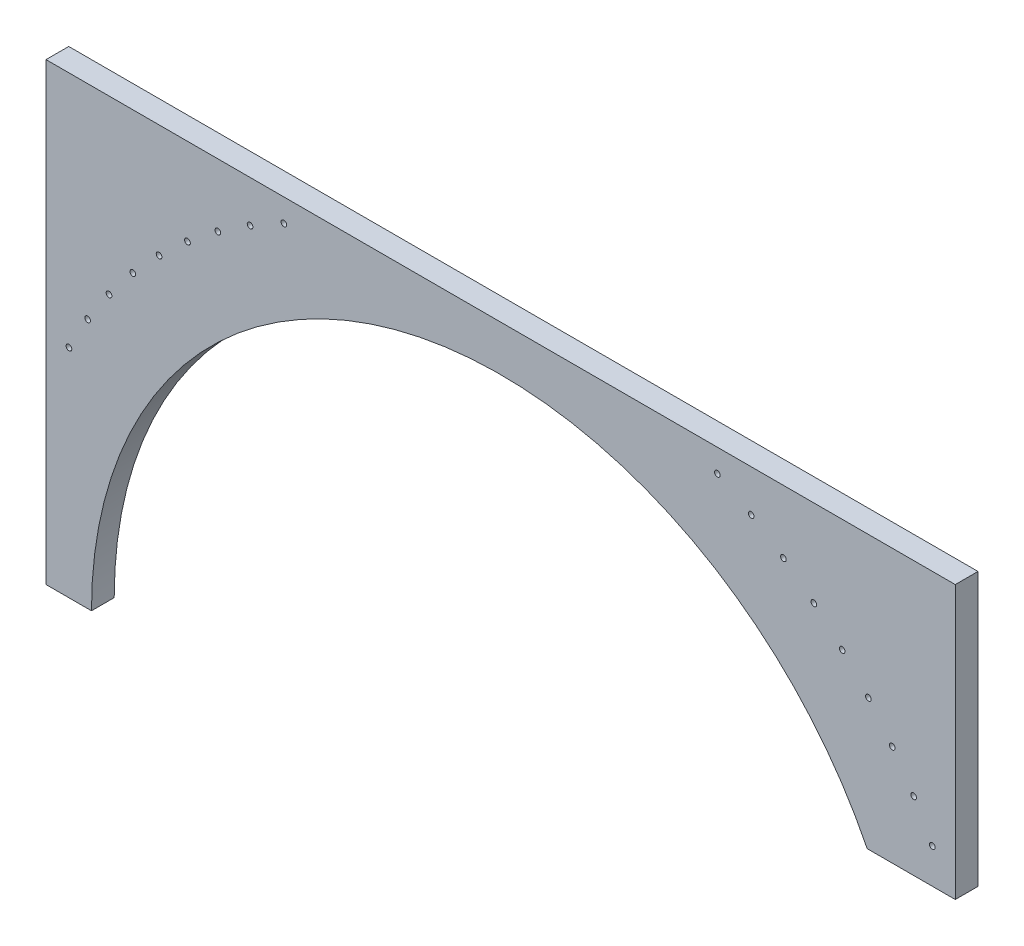
ISO-10303-21;
HEADER;
FILE_DESCRIPTION(('STEP AP214'),'2;1');
FILE_NAME('part.step','',(''),(''),'','','');
FILE_SCHEMA(('AUTOMOTIVE_DESIGN { 1 0 10303 214 1 1 1 1 }'));
ENDSEC;
DATA;
#1=APPLICATION_CONTEXT('core data for automotive mechanical design processes');
#2=APPLICATION_PROTOCOL_DEFINITION('international standard','automotive_design',2000,#1);
#3=PRODUCT_CONTEXT('',#1,'mechanical');
#4=PRODUCT('Part','Part','',(#3));
#5=PRODUCT_RELATED_PRODUCT_CATEGORY('part','',(#4));
#6=PRODUCT_DEFINITION_FORMATION('','',#4);
#7=PRODUCT_DEFINITION_CONTEXT('part definition',#1,'design');
#8=PRODUCT_DEFINITION('design','',#6,#7);
#9=PRODUCT_DEFINITION_SHAPE('','',#8);
#10=(LENGTH_UNIT() NAMED_UNIT(*) SI_UNIT(.MILLI.,.METRE.));
#11=(NAMED_UNIT(*) PLANE_ANGLE_UNIT() SI_UNIT($,.RADIAN.));
#12=(NAMED_UNIT(*) SI_UNIT($,.STERADIAN.) SOLID_ANGLE_UNIT());
#13=UNCERTAINTY_MEASURE_WITH_UNIT(LENGTH_MEASURE(1.E-05),#10,'distance_accuracy_value','');
#14=(GEOMETRIC_REPRESENTATION_CONTEXT(3) GLOBAL_UNCERTAINTY_ASSIGNED_CONTEXT((#13)) GLOBAL_UNIT_ASSIGNED_CONTEXT((#10,
#11,#12)) REPRESENTATION_CONTEXT('',''));
#15=CARTESIAN_POINT('',(0.,0.,0.));
#16=DIRECTION('',(0.,0.,1.));
#17=DIRECTION('',(1.,0.,0.));
#18=AXIS2_PLACEMENT_3D('',#15,#16,#17);
#19=CARTESIAN_POINT('',(40.,16.,2.));
#20=DIRECTION('',(0.,1.,0.));
#21=DIRECTION('',(0.,0.,1.));
#22=AXIS2_PLACEMENT_3D('',#19,#20,#21);
#23=PLANE('',#22);
#24=DIRECTION('',(1.,0.,0.));
#25=VECTOR('',#24,1.);
#26=CARTESIAN_POINT('',(40.,16.,0.));
#27=LINE('',#26,#25);
#28=CARTESIAN_POINT('',(32.2490309931942,16.,0.));
#29=VERTEX_POINT('',#28);
#30=CARTESIAN_POINT('',(40.,16.,0.));
#31=VERTEX_POINT('',#30);
#32=EDGE_CURVE('E117',#29,#31,#27,.T.);
#33=ORIENTED_EDGE('',*,*,#32,.T.);
#34=DIRECTION('',(0.,0.,-1.));
#35=VECTOR('',#34,1.);
#36=CARTESIAN_POINT('',(40.,16.,2.));
#37=LINE('',#36,#35);
#38=CARTESIAN_POINT('',(40.,16.,2.));
#39=VERTEX_POINT('',#38);
#40=EDGE_CURVE('E11',#39,#31,#37,.T.);
#41=ORIENTED_EDGE('',*,*,#40,.F.);
#42=DIRECTION('',(1.,0.,0.));
#43=VECTOR('',#42,1.);
#44=CARTESIAN_POINT('',(40.,16.,2.));
#45=LINE('',#44,#43);
#46=CARTESIAN_POINT('',(32.2490309931942,16.,2.));
#47=VERTEX_POINT('',#46);
#48=EDGE_CURVE('E128',#47,#39,#45,.T.);
#49=ORIENTED_EDGE('',*,*,#48,.F.);
#50=DIRECTION('',(0.,0.,-1.));
#51=VECTOR('',#50,1.);
#52=CARTESIAN_POINT('',(32.2490309931942,16.,2.));
#53=LINE('',#52,#51);
#54=EDGE_CURVE('E113',#47,#29,#53,.T.);
#55=ORIENTED_EDGE('',*,*,#54,.T.);
#56=EDGE_LOOP('',(#33,#41,#49,#55));
#57=FACE_BOUND('',#56,.T.);
#58=ADVANCED_FACE('F33',(#57),#23,.F.);
#59=CARTESIAN_POINT('',(40.,16.,2.));
#60=DIRECTION('',(-1.,0.,0.));
#61=DIRECTION('',(0.,-1.,0.));
#62=AXIS2_PLACEMENT_3D('',#59,#60,#61);
#63=PLANE('',#62);
#64=DIRECTION('',(0.,1.,0.));
#65=VECTOR('',#64,1.);
#66=CARTESIAN_POINT('',(40.,16.,0.));
#67=LINE('',#66,#65);
#68=CARTESIAN_POINT('',(40.,40.,0.));
#69=VERTEX_POINT('',#68);
#70=EDGE_CURVE('E120',#31,#69,#67,.T.);
#71=ORIENTED_EDGE('',*,*,#70,.T.);
#72=DIRECTION('',(0.,0.,-1.));
#73=VECTOR('',#72,1.);
#74=CARTESIAN_POINT('',(40.,40.,2.));
#75=LINE('',#74,#73);
#76=CARTESIAN_POINT('',(40.,40.,2.));
#77=VERTEX_POINT('',#76);
#78=EDGE_CURVE('E41',#77,#69,#75,.T.);
#79=ORIENTED_EDGE('',*,*,#78,.F.);
#80=DIRECTION('',(0.,1.,0.));
#81=VECTOR('',#80,1.);
#82=CARTESIAN_POINT('',(40.,16.,2.));
#83=LINE('',#82,#81);
#84=EDGE_CURVE('E86',#39,#77,#83,.T.);
#85=ORIENTED_EDGE('',*,*,#84,.F.);
#86=ORIENTED_EDGE('',*,*,#40,.T.);
#87=EDGE_LOOP('',(#71,#79,#85,#86));
#88=FACE_BOUND('',#87,.T.);
#89=ADVANCED_FACE('F153',(#88),#63,.F.);
#90=CARTESIAN_POINT('',(40.,40.,2.));
#91=DIRECTION('',(0.,-1.,0.));
#92=DIRECTION('',(1.,0.,0.));
#93=AXIS2_PLACEMENT_3D('',#90,#91,#92);
#94=PLANE('',#93);
#95=DIRECTION('',(-1.,0.,0.));
#96=VECTOR('',#95,1.);
#97=CARTESIAN_POINT('',(40.,40.,0.));
#98=LINE('',#97,#96);
#99=CARTESIAN_POINT('',(-40.,40.,0.));
#100=VERTEX_POINT('',#99);
#101=EDGE_CURVE('E123',#69,#100,#98,.T.);
#102=ORIENTED_EDGE('',*,*,#101,.T.);
#103=DIRECTION('',(0.,0.,-1.));
#104=VECTOR('',#103,1.);
#105=CARTESIAN_POINT('',(-40.,40.,2.));
#106=LINE('',#105,#104);
#107=CARTESIAN_POINT('',(-40.,40.,2.));
#108=VERTEX_POINT('',#107);
#109=EDGE_CURVE('E108',#108,#100,#106,.T.);
#110=ORIENTED_EDGE('',*,*,#109,.F.);
#111=DIRECTION('',(-1.,0.,0.));
#112=VECTOR('',#111,1.);
#113=CARTESIAN_POINT('',(40.,40.,2.));
#114=LINE('',#113,#112);
#115=EDGE_CURVE('E99',#77,#108,#114,.T.);
#116=ORIENTED_EDGE('',*,*,#115,.F.);
#117=ORIENTED_EDGE('',*,*,#78,.T.);
#118=EDGE_LOOP('',(#102,#110,#116,#117));
#119=FACE_BOUND('',#118,.T.);
#120=ADVANCED_FACE('F134',(#119),#94,.F.);
#121=CARTESIAN_POINT('',(-40.,40.,2.));
#122=DIRECTION('',(1.,0.,0.));
#123=DIRECTION('',(0.,1.,0.));
#124=AXIS2_PLACEMENT_3D('',#121,#122,#123);
#125=PLANE('',#124);
#126=DIRECTION('',(0.,-1.,0.));
#127=VECTOR('',#126,1.);
#128=CARTESIAN_POINT('',(-40.,40.,0.));
#129=LINE('',#128,#127);
#130=CARTESIAN_POINT('',(-40.,0.,0.));
#131=VERTEX_POINT('',#130);
#132=EDGE_CURVE('E107',#100,#131,#129,.T.);
#133=ORIENTED_EDGE('',*,*,#132,.T.);
#134=DIRECTION('',(0.,0.,-1.));
#135=VECTOR('',#134,1.);
#136=CARTESIAN_POINT('',(-40.,0.,2.));
#137=LINE('',#136,#135);
#138=CARTESIAN_POINT('',(-40.,0.,2.));
#139=VERTEX_POINT('',#138);
#140=EDGE_CURVE('E104',#139,#131,#137,.T.);
#141=ORIENTED_EDGE('',*,*,#140,.F.);
#142=DIRECTION('',(0.,-1.,0.));
#143=VECTOR('',#142,1.);
#144=CARTESIAN_POINT('',(-40.,40.,2.));
#145=LINE('',#144,#143);
#146=EDGE_CURVE('E93',#108,#139,#145,.T.);
#147=ORIENTED_EDGE('',*,*,#146,.F.);
#148=ORIENTED_EDGE('',*,*,#109,.T.);
#149=EDGE_LOOP('',(#133,#141,#147,#148));
#150=FACE_BOUND('',#149,.T.);
#151=ADVANCED_FACE('F105',(#150),#125,.F.);
#152=CARTESIAN_POINT('',(-36.,0.,2.));
#153=DIRECTION('',(0.,1.,0.));
#154=DIRECTION('',(-1.,0.,0.));
#155=AXIS2_PLACEMENT_3D('',#152,#153,#154);
#156=PLANE('',#155);
#157=DIRECTION('',(1.,0.,0.));
#158=VECTOR('',#157,1.);
#159=CARTESIAN_POINT('',(-36.,0.,0.));
#160=LINE('',#159,#158);
#161=CARTESIAN_POINT('',(-36.,0.,0.));
#162=VERTEX_POINT('',#161);
#163=EDGE_CURVE('E72',#131,#162,#160,.T.);
#164=ORIENTED_EDGE('',*,*,#163,.T.);
#165=DIRECTION('',(0.,0.,-1.));
#166=VECTOR('',#165,1.);
#167=CARTESIAN_POINT('',(-36.,0.,2.));
#168=LINE('',#167,#166);
#169=CARTESIAN_POINT('',(-36.,0.,2.));
#170=VERTEX_POINT('',#169);
#171=EDGE_CURVE('E109',#170,#162,#168,.T.);
#172=ORIENTED_EDGE('',*,*,#171,.F.);
#173=DIRECTION('',(1.,0.,0.));
#174=VECTOR('',#173,1.);
#175=CARTESIAN_POINT('',(-36.,0.,2.));
#176=LINE('',#175,#174);
#177=EDGE_CURVE('E97',#139,#170,#176,.T.);
#178=ORIENTED_EDGE('',*,*,#177,.F.);
#179=ORIENTED_EDGE('',*,*,#140,.T.);
#180=EDGE_LOOP('',(#164,#172,#178,#179));
#181=FACE_BOUND('',#180,.T.);
#182=ADVANCED_FACE('F111',(#181),#156,.F.);
#183=CARTESIAN_POINT('',(0.,0.,2.));
#184=DIRECTION('',(0.,0.,-1.));
#185=DIRECTION('',(-1.,0.,0.));
#186=AXIS2_PLACEMENT_3D('',#183,#184,#185);
#187=CYLINDRICAL_SURFACE('',#186,36.);
#188=CARTESIAN_POINT('',(0.,0.,0.));
#189=DIRECTION('',(0.,0.,-1.));
#190=DIRECTION('',(1.,0.,0.));
#191=AXIS2_PLACEMENT_3D('',#188,#189,#190);
#192=CIRCLE('',#191,36.);
#193=EDGE_CURVE('E78',#162,#29,#192,.T.);
#194=ORIENTED_EDGE('',*,*,#193,.T.);
#195=ORIENTED_EDGE('',*,*,#54,.F.);
#196=CARTESIAN_POINT('',(0.,0.,2.));
#197=DIRECTION('',(0.,0.,-1.));
#198=DIRECTION('',(1.,0.,0.));
#199=AXIS2_PLACEMENT_3D('',#196,#197,#198);
#200=CIRCLE('',#199,36.);
#201=EDGE_CURVE('E49',#170,#47,#200,.T.);
#202=ORIENTED_EDGE('',*,*,#201,.F.);
#203=ORIENTED_EDGE('',*,*,#171,.T.);
#204=EDGE_LOOP('',(#194,#195,#202,#203));
#205=FACE_BOUND('',#204,.T.);
#206=ADVANCED_FACE('F141',(#205),#187,.F.);
#207=CARTESIAN_POINT('',(0.,0.,2.));
#208=DIRECTION('',(0.,0.,1.));
#209=DIRECTION('',(1.,0.,0.));
#210=AXIS2_PLACEMENT_3D('',#207,#208,#209);
#211=PLANE('',#210);
#212=CARTESIAN_POINT('',(37.9814539466944,19.0698493988598,2.));
#213=DIRECTION('',(0.,0.,1.));
#214=DIRECTION('',(-1.,0.,0.));
#215=AXIS2_PLACEMENT_3D('',#212,#213,#214);
#216=CIRCLE('',#215,0.25);
#217=CARTESIAN_POINT('',(37.7314539466944,19.0698493988598,2.));
#218=VERTEX_POINT('',#217);
#219=EDGE_CURVE('E379',#218,#218,#216,.T.);
#220=ORIENTED_EDGE('',*,*,#219,.F.);
#221=EDGE_LOOP('',(#220));
#222=FACE_BOUND('',#221,.T.);
#223=CARTESIAN_POINT('',(36.3355463010969,22.0449104103625,2.));
#224=DIRECTION('',(0.,0.,1.));
#225=DIRECTION('',(-1.,0.,0.));
#226=AXIS2_PLACEMENT_3D('',#223,#224,#225);
#227=CIRCLE('',#226,0.25);
#228=CARTESIAN_POINT('',(36.0855463010969,22.0449104103625,2.));
#229=VERTEX_POINT('',#228);
#230=EDGE_CURVE('E381',#229,#229,#227,.T.);
#231=ORIENTED_EDGE('',*,*,#230,.F.);
#232=EDGE_LOOP('',(#231));
#233=FACE_BOUND('',#232,.T.);
#234=CARTESIAN_POINT('',(34.4570911591722,24.8788839952389,2.));
#235=DIRECTION('',(0.,0.,1.));
#236=DIRECTION('',(-1.,0.,0.));
#237=AXIS2_PLACEMENT_3D('',#234,#235,#236);
#238=CIRCLE('',#237,0.249999999999993);
#239=CARTESIAN_POINT('',(34.2070911591723,24.8788839952389,2.));
#240=VERTEX_POINT('',#239);
#241=EDGE_CURVE('E387',#240,#240,#238,.T.);
#242=ORIENTED_EDGE('',*,*,#241,.F.);
#243=EDGE_LOOP('',(#242));
#244=FACE_BOUND('',#243,.T.);
#245=CARTESIAN_POINT('',(32.358110633829,27.5536327225457,2.));
#246=DIRECTION('',(0.,0.,1.));
#247=DIRECTION('',(-1.,0.,0.));
#248=AXIS2_PLACEMENT_3D('',#245,#246,#247);
#249=CIRCLE('',#248,0.250000000000006);
#250=CARTESIAN_POINT('',(32.1081106338289,27.5536327225457,2.));
#251=VERTEX_POINT('',#250);
#252=EDGE_CURVE('E393',#251,#251,#249,.T.);
#253=ORIENTED_EDGE('',*,*,#252,.F.);
#254=EDGE_LOOP('',(#253));
#255=FACE_BOUND('',#254,.T.);
#256=CARTESIAN_POINT('',(30.0520382004291,30.0520382004283,2.));
#257=DIRECTION('',(0.,0.,1.));
#258=DIRECTION('',(-1.,0.,0.));
#259=AXIS2_PLACEMENT_3D('',#256,#257,#258);
#260=CIRCLE('',#259,0.249999999999992);
#261=CARTESIAN_POINT('',(29.8020382004291,30.0520382004283,2.));
#262=VERTEX_POINT('',#261);
#263=EDGE_CURVE('E399',#262,#262,#260,.T.);
#264=ORIENTED_EDGE('',*,*,#263,.F.);
#265=EDGE_LOOP('',(#264));
#266=FACE_BOUND('',#265,.T.);
#267=CARTESIAN_POINT('',(27.5536327225466,32.358110633828,2.));
#268=DIRECTION('',(0.,0.,1.));
#269=DIRECTION('',(-1.,0.,0.));
#270=AXIS2_PLACEMENT_3D('',#267,#268,#269);
#271=CIRCLE('',#270,0.25);
#272=CARTESIAN_POINT('',(27.3036327225466,32.358110633828,2.));
#273=VERTEX_POINT('',#272);
#274=EDGE_CURVE('E405',#273,#273,#271,.T.);
#275=ORIENTED_EDGE('',*,*,#274,.F.);
#276=EDGE_LOOP('',(#275));
#277=FACE_BOUND('',#276,.T.);
#278=CARTESIAN_POINT('',(24.8788839952397,34.4570911591713,2.));
#279=DIRECTION('',(0.,0.,1.));
#280=DIRECTION('',(-1.,0.,0.));
#281=AXIS2_PLACEMENT_3D('',#278,#279,#280);
#282=CIRCLE('',#281,0.250000000000003);
#283=CARTESIAN_POINT('',(24.6288839952397,34.4570911591713,2.));
#284=VERTEX_POINT('',#283);
#285=EDGE_CURVE('E411',#284,#284,#282,.T.);
#286=ORIENTED_EDGE('',*,*,#285,.F.);
#287=EDGE_LOOP('',(#286));
#288=FACE_BOUND('',#287,.T.);
#289=CARTESIAN_POINT('',(22.0449104103634,36.335546301096,2.));
#290=DIRECTION('',(0.,0.,1.));
#291=DIRECTION('',(-1.,0.,0.));
#292=AXIS2_PLACEMENT_3D('',#289,#290,#291);
#293=CIRCLE('',#292,0.25);
#294=CARTESIAN_POINT('',(21.7949104103634,36.335546301096,2.));
#295=VERTEX_POINT('',#294);
#296=EDGE_CURVE('E417',#295,#295,#293,.T.);
#297=ORIENTED_EDGE('',*,*,#296,.F.);
#298=EDGE_LOOP('',(#297));
#299=FACE_BOUND('',#298,.T.);
#300=CARTESIAN_POINT('',(19.0698493988607,37.9814539466935,2.));
#301=DIRECTION('',(0.,0.,1.));
#302=DIRECTION('',(-1.,0.,0.));
#303=AXIS2_PLACEMENT_3D('',#300,#301,#302);
#304=CIRCLE('',#303,0.250000000000006);
#305=CARTESIAN_POINT('',(18.8198493988607,37.9814539466935,2.));
#306=VERTEX_POINT('',#305);
#307=EDGE_CURVE('E423',#306,#306,#304,.T.);
#308=ORIENTED_EDGE('',*,*,#307,.F.);
#309=EDGE_LOOP('',(#308));
#310=FACE_BOUND('',#309,.T.);
#311=CARTESIAN_POINT('',(-19.0698493988607,37.9814539466935,2.));
#312=DIRECTION('',(0.,0.,1.));
#313=DIRECTION('',(1.,0.,0.));
#314=AXIS2_PLACEMENT_3D('',#311,#312,#313);
#315=CIRCLE('',#314,0.250000000000006);
#316=CARTESIAN_POINT('',(-18.8198493988607,37.9814539466935,2.));
#317=VERTEX_POINT('',#316);
#318=EDGE_CURVE('E429',#317,#317,#315,.T.);
#319=ORIENTED_EDGE('',*,*,#318,.F.);
#320=EDGE_LOOP('',(#319));
#321=FACE_BOUND('',#320,.T.);
#322=CARTESIAN_POINT('',(-22.0449104103634,36.335546301096,2.));
#323=DIRECTION('',(0.,0.,1.));
#324=DIRECTION('',(1.,0.,0.));
#325=AXIS2_PLACEMENT_3D('',#322,#323,#324);
#326=CIRCLE('',#325,0.25);
#327=CARTESIAN_POINT('',(-21.7949104103634,36.335546301096,2.));
#328=VERTEX_POINT('',#327);
#329=EDGE_CURVE('E435',#328,#328,#326,.T.);
#330=ORIENTED_EDGE('',*,*,#329,.F.);
#331=EDGE_LOOP('',(#330));
#332=FACE_BOUND('',#331,.T.);
#333=CARTESIAN_POINT('',(-24.8788839952397,34.4570911591713,2.));
#334=DIRECTION('',(0.,0.,1.));
#335=DIRECTION('',(1.,0.,0.));
#336=AXIS2_PLACEMENT_3D('',#333,#334,#335);
#337=CIRCLE('',#336,0.250000000000003);
#338=CARTESIAN_POINT('',(-24.6288839952397,34.4570911591713,2.));
#339=VERTEX_POINT('',#338);
#340=EDGE_CURVE('E441',#339,#339,#337,.T.);
#341=ORIENTED_EDGE('',*,*,#340,.F.);
#342=EDGE_LOOP('',(#341));
#343=FACE_BOUND('',#342,.T.);
#344=CARTESIAN_POINT('',(-27.5536327225466,32.358110633828,2.));
#345=DIRECTION('',(0.,0.,1.));
#346=DIRECTION('',(1.,0.,0.));
#347=AXIS2_PLACEMENT_3D('',#344,#345,#346);
#348=CIRCLE('',#347,0.25);
#349=CARTESIAN_POINT('',(-27.3036327225466,32.358110633828,2.));
#350=VERTEX_POINT('',#349);
#351=EDGE_CURVE('E447',#350,#350,#348,.T.);
#352=ORIENTED_EDGE('',*,*,#351,.F.);
#353=EDGE_LOOP('',(#352));
#354=FACE_BOUND('',#353,.T.);
#355=CARTESIAN_POINT('',(-30.0520382004291,30.0520382004283,2.));
#356=DIRECTION('',(0.,0.,1.));
#357=DIRECTION('',(1.,0.,0.));
#358=AXIS2_PLACEMENT_3D('',#355,#356,#357);
#359=CIRCLE('',#358,0.249999999999992);
#360=CARTESIAN_POINT('',(-29.8020382004291,30.0520382004283,2.));
#361=VERTEX_POINT('',#360);
#362=EDGE_CURVE('E453',#361,#361,#359,.T.);
#363=ORIENTED_EDGE('',*,*,#362,.F.);
#364=EDGE_LOOP('',(#363));
#365=FACE_BOUND('',#364,.T.);
#366=CARTESIAN_POINT('',(-32.358110633829,27.5536327225457,2.));
#367=DIRECTION('',(0.,0.,1.));
#368=DIRECTION('',(1.,0.,0.));
#369=AXIS2_PLACEMENT_3D('',#366,#367,#368);
#370=CIRCLE('',#369,0.250000000000006);
#371=CARTESIAN_POINT('',(-32.1081106338289,27.5536327225457,2.));
#372=VERTEX_POINT('',#371);
#373=EDGE_CURVE('E459',#372,#372,#370,.T.);
#374=ORIENTED_EDGE('',*,*,#373,.F.);
#375=EDGE_LOOP('',(#374));
#376=FACE_BOUND('',#375,.T.);
#377=CARTESIAN_POINT('',(-34.4570911591722,24.8788839952389,2.));
#378=DIRECTION('',(0.,0.,1.));
#379=DIRECTION('',(1.,0.,0.));
#380=AXIS2_PLACEMENT_3D('',#377,#378,#379);
#381=CIRCLE('',#380,0.249999999999993);
#382=CARTESIAN_POINT('',(-34.2070911591723,24.8788839952389,2.));
#383=VERTEX_POINT('',#382);
#384=EDGE_CURVE('E465',#383,#383,#381,.T.);
#385=ORIENTED_EDGE('',*,*,#384,.F.);
#386=EDGE_LOOP('',(#385));
#387=FACE_BOUND('',#386,.T.);
#388=CARTESIAN_POINT('',(-36.3355463010969,22.0449104103625,2.));
#389=DIRECTION('',(0.,0.,1.));
#390=DIRECTION('',(1.,0.,0.));
#391=AXIS2_PLACEMENT_3D('',#388,#389,#390);
#392=CIRCLE('',#391,0.25);
#393=CARTESIAN_POINT('',(-36.0855463010969,22.0449104103625,2.));
#394=VERTEX_POINT('',#393);
#395=EDGE_CURVE('E471',#394,#394,#392,.T.);
#396=ORIENTED_EDGE('',*,*,#395,.F.);
#397=EDGE_LOOP('',(#396));
#398=FACE_BOUND('',#397,.T.);
#399=CARTESIAN_POINT('',(-37.9814539466944,19.0698493988598,2.));
#400=DIRECTION('',(0.,0.,1.));
#401=DIRECTION('',(1.,0.,0.));
#402=AXIS2_PLACEMENT_3D('',#399,#400,#401);
#403=CIRCLE('',#402,0.25);
#404=CARTESIAN_POINT('',(-37.7314539466944,19.0698493988598,2.));
#405=VERTEX_POINT('',#404);
#406=EDGE_CURVE('E477',#405,#405,#403,.T.);
#407=ORIENTED_EDGE('',*,*,#406,.F.);
#408=EDGE_LOOP('',(#407));
#409=FACE_BOUND('',#408,.T.);
#410=ORIENTED_EDGE('',*,*,#48,.T.);
#411=ORIENTED_EDGE('',*,*,#84,.T.);
#412=ORIENTED_EDGE('',*,*,#115,.T.);
#413=ORIENTED_EDGE('',*,*,#146,.T.);
#414=ORIENTED_EDGE('',*,*,#177,.T.);
#415=ORIENTED_EDGE('',*,*,#201,.T.);
#416=EDGE_LOOP('',(#410,#411,#412,#413,#414,#415));
#417=FACE_BOUND('',#416,.T.);
#418=ADVANCED_FACE('F95',(#222,#233,#244,#255,#266,#277,#288,#299,#310,#321,#332,#343,#354,#365,
#376,#387,#398,#409,#417),#211,.T.);
#419=CARTESIAN_POINT('',(0.,0.,0.));
#420=DIRECTION('',(0.,0.,1.));
#421=DIRECTION('',(1.,0.,0.));
#422=AXIS2_PLACEMENT_3D('',#419,#420,#421);
#423=PLANE('',#422);
#424=CARTESIAN_POINT('',(37.9814539466944,19.0698493988598,0.));
#425=DIRECTION('',(0.,0.,1.));
#426=DIRECTION('',(-1.,0.,0.));
#427=AXIS2_PLACEMENT_3D('',#424,#425,#426);
#428=CIRCLE('',#427,0.25);
#429=CARTESIAN_POINT('',(37.7314539466944,19.0698493988598,0.));
#430=VERTEX_POINT('',#429);
#431=EDGE_CURVE('E376',#430,#430,#428,.T.);
#432=ORIENTED_EDGE('',*,*,#431,.T.);
#433=EDGE_LOOP('',(#432));
#434=FACE_BOUND('',#433,.T.);
#435=CARTESIAN_POINT('',(36.3355463010969,22.0449104103625,0.));
#436=DIRECTION('',(0.,0.,1.));
#437=DIRECTION('',(-1.,0.,0.));
#438=AXIS2_PLACEMENT_3D('',#435,#436,#437);
#439=CIRCLE('',#438,0.25);
#440=CARTESIAN_POINT('',(36.0855463010969,22.0449104103625,0.));
#441=VERTEX_POINT('',#440);
#442=EDGE_CURVE('E384',#441,#441,#439,.T.);
#443=ORIENTED_EDGE('',*,*,#442,.T.);
#444=EDGE_LOOP('',(#443));
#445=FACE_BOUND('',#444,.T.);
#446=CARTESIAN_POINT('',(34.4570911591722,24.8788839952389,0.));
#447=DIRECTION('',(0.,0.,1.));
#448=DIRECTION('',(-1.,0.,0.));
#449=AXIS2_PLACEMENT_3D('',#446,#447,#448);
#450=CIRCLE('',#449,0.249999999999993);
#451=CARTESIAN_POINT('',(34.2070911591723,24.8788839952389,0.));
#452=VERTEX_POINT('',#451);
#453=EDGE_CURVE('E390',#452,#452,#450,.T.);
#454=ORIENTED_EDGE('',*,*,#453,.T.);
#455=EDGE_LOOP('',(#454));
#456=FACE_BOUND('',#455,.T.);
#457=CARTESIAN_POINT('',(32.358110633829,27.5536327225457,0.));
#458=DIRECTION('',(0.,0.,1.));
#459=DIRECTION('',(-1.,0.,0.));
#460=AXIS2_PLACEMENT_3D('',#457,#458,#459);
#461=CIRCLE('',#460,0.250000000000006);
#462=CARTESIAN_POINT('',(32.1081106338289,27.5536327225457,0.));
#463=VERTEX_POINT('',#462);
#464=EDGE_CURVE('E396',#463,#463,#461,.T.);
#465=ORIENTED_EDGE('',*,*,#464,.T.);
#466=EDGE_LOOP('',(#465));
#467=FACE_BOUND('',#466,.T.);
#468=CARTESIAN_POINT('',(30.0520382004291,30.0520382004283,0.));
#469=DIRECTION('',(0.,0.,1.));
#470=DIRECTION('',(-1.,0.,0.));
#471=AXIS2_PLACEMENT_3D('',#468,#469,#470);
#472=CIRCLE('',#471,0.249999999999992);
#473=CARTESIAN_POINT('',(29.8020382004291,30.0520382004283,0.));
#474=VERTEX_POINT('',#473);
#475=EDGE_CURVE('E402',#474,#474,#472,.T.);
#476=ORIENTED_EDGE('',*,*,#475,.T.);
#477=EDGE_LOOP('',(#476));
#478=FACE_BOUND('',#477,.T.);
#479=CARTESIAN_POINT('',(27.5536327225466,32.358110633828,0.));
#480=DIRECTION('',(0.,0.,1.));
#481=DIRECTION('',(-1.,0.,0.));
#482=AXIS2_PLACEMENT_3D('',#479,#480,#481);
#483=CIRCLE('',#482,0.25);
#484=CARTESIAN_POINT('',(27.3036327225466,32.358110633828,0.));
#485=VERTEX_POINT('',#484);
#486=EDGE_CURVE('E408',#485,#485,#483,.T.);
#487=ORIENTED_EDGE('',*,*,#486,.T.);
#488=EDGE_LOOP('',(#487));
#489=FACE_BOUND('',#488,.T.);
#490=CARTESIAN_POINT('',(24.8788839952397,34.4570911591713,0.));
#491=DIRECTION('',(0.,0.,1.));
#492=DIRECTION('',(-1.,0.,0.));
#493=AXIS2_PLACEMENT_3D('',#490,#491,#492);
#494=CIRCLE('',#493,0.250000000000003);
#495=CARTESIAN_POINT('',(24.6288839952397,34.4570911591713,0.));
#496=VERTEX_POINT('',#495);
#497=EDGE_CURVE('E414',#496,#496,#494,.T.);
#498=ORIENTED_EDGE('',*,*,#497,.T.);
#499=EDGE_LOOP('',(#498));
#500=FACE_BOUND('',#499,.T.);
#501=CARTESIAN_POINT('',(22.0449104103634,36.335546301096,0.));
#502=DIRECTION('',(0.,0.,1.));
#503=DIRECTION('',(-1.,0.,0.));
#504=AXIS2_PLACEMENT_3D('',#501,#502,#503);
#505=CIRCLE('',#504,0.25);
#506=CARTESIAN_POINT('',(21.7949104103634,36.335546301096,0.));
#507=VERTEX_POINT('',#506);
#508=EDGE_CURVE('E420',#507,#507,#505,.T.);
#509=ORIENTED_EDGE('',*,*,#508,.T.);
#510=EDGE_LOOP('',(#509));
#511=FACE_BOUND('',#510,.T.);
#512=CARTESIAN_POINT('',(19.0698493988607,37.9814539466935,0.));
#513=DIRECTION('',(0.,0.,1.));
#514=DIRECTION('',(-1.,0.,0.));
#515=AXIS2_PLACEMENT_3D('',#512,#513,#514);
#516=CIRCLE('',#515,0.250000000000006);
#517=CARTESIAN_POINT('',(18.8198493988607,37.9814539466935,0.));
#518=VERTEX_POINT('',#517);
#519=EDGE_CURVE('E426',#518,#518,#516,.T.);
#520=ORIENTED_EDGE('',*,*,#519,.T.);
#521=EDGE_LOOP('',(#520));
#522=FACE_BOUND('',#521,.T.);
#523=CARTESIAN_POINT('',(-19.0698493988607,37.9814539466935,0.));
#524=DIRECTION('',(0.,0.,1.));
#525=DIRECTION('',(1.,0.,0.));
#526=AXIS2_PLACEMENT_3D('',#523,#524,#525);
#527=CIRCLE('',#526,0.250000000000006);
#528=CARTESIAN_POINT('',(-18.8198493988607,37.9814539466935,0.));
#529=VERTEX_POINT('',#528);
#530=EDGE_CURVE('E432',#529,#529,#527,.T.);
#531=ORIENTED_EDGE('',*,*,#530,.T.);
#532=EDGE_LOOP('',(#531));
#533=FACE_BOUND('',#532,.T.);
#534=CARTESIAN_POINT('',(-22.0449104103634,36.335546301096,0.));
#535=DIRECTION('',(0.,0.,1.));
#536=DIRECTION('',(1.,0.,0.));
#537=AXIS2_PLACEMENT_3D('',#534,#535,#536);
#538=CIRCLE('',#537,0.25);
#539=CARTESIAN_POINT('',(-21.7949104103634,36.335546301096,0.));
#540=VERTEX_POINT('',#539);
#541=EDGE_CURVE('E438',#540,#540,#538,.T.);
#542=ORIENTED_EDGE('',*,*,#541,.T.);
#543=EDGE_LOOP('',(#542));
#544=FACE_BOUND('',#543,.T.);
#545=CARTESIAN_POINT('',(-24.8788839952397,34.4570911591713,0.));
#546=DIRECTION('',(0.,0.,1.));
#547=DIRECTION('',(1.,0.,0.));
#548=AXIS2_PLACEMENT_3D('',#545,#546,#547);
#549=CIRCLE('',#548,0.250000000000003);
#550=CARTESIAN_POINT('',(-24.6288839952397,34.4570911591713,0.));
#551=VERTEX_POINT('',#550);
#552=EDGE_CURVE('E444',#551,#551,#549,.T.);
#553=ORIENTED_EDGE('',*,*,#552,.T.);
#554=EDGE_LOOP('',(#553));
#555=FACE_BOUND('',#554,.T.);
#556=CARTESIAN_POINT('',(-27.5536327225466,32.358110633828,0.));
#557=DIRECTION('',(0.,0.,1.));
#558=DIRECTION('',(1.,0.,0.));
#559=AXIS2_PLACEMENT_3D('',#556,#557,#558);
#560=CIRCLE('',#559,0.25);
#561=CARTESIAN_POINT('',(-27.3036327225466,32.358110633828,0.));
#562=VERTEX_POINT('',#561);
#563=EDGE_CURVE('E450',#562,#562,#560,.T.);
#564=ORIENTED_EDGE('',*,*,#563,.T.);
#565=EDGE_LOOP('',(#564));
#566=FACE_BOUND('',#565,.T.);
#567=CARTESIAN_POINT('',(-30.0520382004291,30.0520382004283,0.));
#568=DIRECTION('',(0.,0.,1.));
#569=DIRECTION('',(1.,0.,0.));
#570=AXIS2_PLACEMENT_3D('',#567,#568,#569);
#571=CIRCLE('',#570,0.249999999999992);
#572=CARTESIAN_POINT('',(-29.8020382004291,30.0520382004283,0.));
#573=VERTEX_POINT('',#572);
#574=EDGE_CURVE('E456',#573,#573,#571,.T.);
#575=ORIENTED_EDGE('',*,*,#574,.T.);
#576=EDGE_LOOP('',(#575));
#577=FACE_BOUND('',#576,.T.);
#578=CARTESIAN_POINT('',(-32.358110633829,27.5536327225457,0.));
#579=DIRECTION('',(0.,0.,1.));
#580=DIRECTION('',(1.,0.,0.));
#581=AXIS2_PLACEMENT_3D('',#578,#579,#580);
#582=CIRCLE('',#581,0.250000000000006);
#583=CARTESIAN_POINT('',(-32.1081106338289,27.5536327225457,0.));
#584=VERTEX_POINT('',#583);
#585=EDGE_CURVE('E462',#584,#584,#582,.T.);
#586=ORIENTED_EDGE('',*,*,#585,.T.);
#587=EDGE_LOOP('',(#586));
#588=FACE_BOUND('',#587,.T.);
#589=CARTESIAN_POINT('',(-34.4570911591722,24.8788839952389,0.));
#590=DIRECTION('',(0.,0.,1.));
#591=DIRECTION('',(1.,0.,0.));
#592=AXIS2_PLACEMENT_3D('',#589,#590,#591);
#593=CIRCLE('',#592,0.249999999999993);
#594=CARTESIAN_POINT('',(-34.2070911591723,24.8788839952389,0.));
#595=VERTEX_POINT('',#594);
#596=EDGE_CURVE('E468',#595,#595,#593,.T.);
#597=ORIENTED_EDGE('',*,*,#596,.T.);
#598=EDGE_LOOP('',(#597));
#599=FACE_BOUND('',#598,.T.);
#600=CARTESIAN_POINT('',(-36.3355463010969,22.0449104103625,0.));
#601=DIRECTION('',(0.,0.,1.));
#602=DIRECTION('',(1.,0.,0.));
#603=AXIS2_PLACEMENT_3D('',#600,#601,#602);
#604=CIRCLE('',#603,0.25);
#605=CARTESIAN_POINT('',(-36.0855463010969,22.0449104103625,0.));
#606=VERTEX_POINT('',#605);
#607=EDGE_CURVE('E474',#606,#606,#604,.T.);
#608=ORIENTED_EDGE('',*,*,#607,.T.);
#609=EDGE_LOOP('',(#608));
#610=FACE_BOUND('',#609,.T.);
#611=CARTESIAN_POINT('',(-37.9814539466944,19.0698493988598,0.));
#612=DIRECTION('',(0.,0.,1.));
#613=DIRECTION('',(1.,0.,0.));
#614=AXIS2_PLACEMENT_3D('',#611,#612,#613);
#615=CIRCLE('',#614,0.25);
#616=CARTESIAN_POINT('',(-37.7314539466944,19.0698493988598,0.));
#617=VERTEX_POINT('',#616);
#618=EDGE_CURVE('E121',#617,#617,#615,.T.);
#619=ORIENTED_EDGE('',*,*,#618,.T.);
#620=EDGE_LOOP('',(#619));
#621=FACE_BOUND('',#620,.T.);
#622=ORIENTED_EDGE('',*,*,#32,.F.);
#623=ORIENTED_EDGE('',*,*,#193,.F.);
#624=ORIENTED_EDGE('',*,*,#163,.F.);
#625=ORIENTED_EDGE('',*,*,#132,.F.);
#626=ORIENTED_EDGE('',*,*,#101,.F.);
#627=ORIENTED_EDGE('',*,*,#70,.F.);
#628=EDGE_LOOP('',(#622,#623,#624,#625,#626,#627));
#629=FACE_BOUND('',#628,.T.);
#630=ADVANCED_FACE('F137',(#434,#445,#456,#467,#478,#489,#500,#511,#522,#533,#544,#555,#566,
#577,#588,#599,#610,#621,#629),#423,.F.);
#631=CARTESIAN_POINT('',(-37.9814539466944,19.0698493988598,0.));
#632=DIRECTION('',(0.,0.,1.));
#633=DIRECTION('',(1.,0.,0.));
#634=AXIS2_PLACEMENT_3D('',#631,#632,#633);
#635=CYLINDRICAL_SURFACE('',#634,0.25);
#636=ORIENTED_EDGE('',*,*,#618,.F.);
#637=EDGE_LOOP('',(#636));
#638=FACE_BOUND('',#637,.T.);
#639=ORIENTED_EDGE('',*,*,#406,.T.);
#640=EDGE_LOOP('',(#639));
#641=FACE_BOUND('',#640,.T.);
#642=ADVANCED_FACE('F190',(#638,#641),#635,.F.);
#643=CARTESIAN_POINT('',(-36.3355463010969,22.0449104103625,0.));
#644=DIRECTION('',(0.,0.,1.));
#645=DIRECTION('',(1.,0.,0.));
#646=AXIS2_PLACEMENT_3D('',#643,#644,#645);
#647=CYLINDRICAL_SURFACE('',#646,0.25);
#648=ORIENTED_EDGE('',*,*,#607,.F.);
#649=EDGE_LOOP('',(#648));
#650=FACE_BOUND('',#649,.T.);
#651=ORIENTED_EDGE('',*,*,#395,.T.);
#652=EDGE_LOOP('',(#651));
#653=FACE_BOUND('',#652,.T.);
#654=ADVANCED_FACE('F199',(#650,#653),#647,.F.);
#655=CARTESIAN_POINT('',(-34.4570911591722,24.8788839952389,0.));
#656=DIRECTION('',(0.,0.,1.));
#657=DIRECTION('',(1.,0.,0.));
#658=AXIS2_PLACEMENT_3D('',#655,#656,#657);
#659=CYLINDRICAL_SURFACE('',#658,0.249999999999993);
#660=ORIENTED_EDGE('',*,*,#596,.F.);
#661=EDGE_LOOP('',(#660));
#662=FACE_BOUND('',#661,.T.);
#663=ORIENTED_EDGE('',*,*,#384,.T.);
#664=EDGE_LOOP('',(#663));
#665=FACE_BOUND('',#664,.T.);
#666=ADVANCED_FACE('F209',(#662,#665),#659,.F.);
#667=CARTESIAN_POINT('',(-32.358110633829,27.5536327225457,0.));
#668=DIRECTION('',(0.,0.,1.));
#669=DIRECTION('',(1.,0.,0.));
#670=AXIS2_PLACEMENT_3D('',#667,#668,#669);
#671=CYLINDRICAL_SURFACE('',#670,0.250000000000006);
#672=ORIENTED_EDGE('',*,*,#585,.F.);
#673=EDGE_LOOP('',(#672));
#674=FACE_BOUND('',#673,.T.);
#675=ORIENTED_EDGE('',*,*,#373,.T.);
#676=EDGE_LOOP('',(#675));
#677=FACE_BOUND('',#676,.T.);
#678=ADVANCED_FACE('F219',(#674,#677),#671,.F.);
#679=CARTESIAN_POINT('',(-30.0520382004291,30.0520382004283,0.));
#680=DIRECTION('',(0.,0.,1.));
#681=DIRECTION('',(1.,0.,0.));
#682=AXIS2_PLACEMENT_3D('',#679,#680,#681);
#683=CYLINDRICAL_SURFACE('',#682,0.249999999999992);
#684=ORIENTED_EDGE('',*,*,#574,.F.);
#685=EDGE_LOOP('',(#684));
#686=FACE_BOUND('',#685,.T.);
#687=ORIENTED_EDGE('',*,*,#362,.T.);
#688=EDGE_LOOP('',(#687));
#689=FACE_BOUND('',#688,.T.);
#690=ADVANCED_FACE('F229',(#686,#689),#683,.F.);
#691=CARTESIAN_POINT('',(-27.5536327225466,32.358110633828,0.));
#692=DIRECTION('',(0.,0.,1.));
#693=DIRECTION('',(1.,0.,0.));
#694=AXIS2_PLACEMENT_3D('',#691,#692,#693);
#695=CYLINDRICAL_SURFACE('',#694,0.25);
#696=ORIENTED_EDGE('',*,*,#563,.F.);
#697=EDGE_LOOP('',(#696));
#698=FACE_BOUND('',#697,.T.);
#699=ORIENTED_EDGE('',*,*,#351,.T.);
#700=EDGE_LOOP('',(#699));
#701=FACE_BOUND('',#700,.T.);
#702=ADVANCED_FACE('F239',(#698,#701),#695,.F.);
#703=CARTESIAN_POINT('',(-24.8788839952397,34.4570911591713,0.));
#704=DIRECTION('',(0.,0.,1.));
#705=DIRECTION('',(1.,0.,0.));
#706=AXIS2_PLACEMENT_3D('',#703,#704,#705);
#707=CYLINDRICAL_SURFACE('',#706,0.250000000000003);
#708=ORIENTED_EDGE('',*,*,#552,.F.);
#709=EDGE_LOOP('',(#708));
#710=FACE_BOUND('',#709,.T.);
#711=ORIENTED_EDGE('',*,*,#340,.T.);
#712=EDGE_LOOP('',(#711));
#713=FACE_BOUND('',#712,.T.);
#714=ADVANCED_FACE('F249',(#710,#713),#707,.F.);
#715=CARTESIAN_POINT('',(-22.0449104103634,36.335546301096,0.));
#716=DIRECTION('',(0.,0.,1.));
#717=DIRECTION('',(1.,0.,0.));
#718=AXIS2_PLACEMENT_3D('',#715,#716,#717);
#719=CYLINDRICAL_SURFACE('',#718,0.25);
#720=ORIENTED_EDGE('',*,*,#541,.F.);
#721=EDGE_LOOP('',(#720));
#722=FACE_BOUND('',#721,.T.);
#723=ORIENTED_EDGE('',*,*,#329,.T.);
#724=EDGE_LOOP('',(#723));
#725=FACE_BOUND('',#724,.T.);
#726=ADVANCED_FACE('F259',(#722,#725),#719,.F.);
#727=CARTESIAN_POINT('',(-19.0698493988607,37.9814539466935,0.));
#728=DIRECTION('',(0.,0.,1.));
#729=DIRECTION('',(1.,0.,0.));
#730=AXIS2_PLACEMENT_3D('',#727,#728,#729);
#731=CYLINDRICAL_SURFACE('',#730,0.250000000000006);
#732=ORIENTED_EDGE('',*,*,#530,.F.);
#733=EDGE_LOOP('',(#732));
#734=FACE_BOUND('',#733,.T.);
#735=ORIENTED_EDGE('',*,*,#318,.T.);
#736=EDGE_LOOP('',(#735));
#737=FACE_BOUND('',#736,.T.);
#738=ADVANCED_FACE('F269',(#734,#737),#731,.F.);
#739=CARTESIAN_POINT('',(19.0698493988607,37.9814539466935,0.));
#740=DIRECTION('',(0.,0.,1.));
#741=DIRECTION('',(1.,0.,0.));
#742=AXIS2_PLACEMENT_3D('',#739,#740,#741);
#743=CYLINDRICAL_SURFACE('',#742,0.250000000000006);
#744=ORIENTED_EDGE('',*,*,#519,.F.);
#745=EDGE_LOOP('',(#744));
#746=FACE_BOUND('',#745,.T.);
#747=ORIENTED_EDGE('',*,*,#307,.T.);
#748=EDGE_LOOP('',(#747));
#749=FACE_BOUND('',#748,.T.);
#750=ADVANCED_FACE('F279',(#746,#749),#743,.F.);
#751=CARTESIAN_POINT('',(22.0449104103634,36.335546301096,0.));
#752=DIRECTION('',(0.,0.,1.));
#753=DIRECTION('',(1.,0.,0.));
#754=AXIS2_PLACEMENT_3D('',#751,#752,#753);
#755=CYLINDRICAL_SURFACE('',#754,0.25);
#756=ORIENTED_EDGE('',*,*,#508,.F.);
#757=EDGE_LOOP('',(#756));
#758=FACE_BOUND('',#757,.T.);
#759=ORIENTED_EDGE('',*,*,#296,.T.);
#760=EDGE_LOOP('',(#759));
#761=FACE_BOUND('',#760,.T.);
#762=ADVANCED_FACE('F289',(#758,#761),#755,.F.);
#763=CARTESIAN_POINT('',(24.8788839952397,34.4570911591713,0.));
#764=DIRECTION('',(0.,0.,1.));
#765=DIRECTION('',(1.,0.,0.));
#766=AXIS2_PLACEMENT_3D('',#763,#764,#765);
#767=CYLINDRICAL_SURFACE('',#766,0.250000000000003);
#768=ORIENTED_EDGE('',*,*,#497,.F.);
#769=EDGE_LOOP('',(#768));
#770=FACE_BOUND('',#769,.T.);
#771=ORIENTED_EDGE('',*,*,#285,.T.);
#772=EDGE_LOOP('',(#771));
#773=FACE_BOUND('',#772,.T.);
#774=ADVANCED_FACE('F299',(#770,#773),#767,.F.);
#775=CARTESIAN_POINT('',(27.5536327225466,32.358110633828,0.));
#776=DIRECTION('',(0.,0.,1.));
#777=DIRECTION('',(1.,0.,0.));
#778=AXIS2_PLACEMENT_3D('',#775,#776,#777);
#779=CYLINDRICAL_SURFACE('',#778,0.25);
#780=ORIENTED_EDGE('',*,*,#486,.F.);
#781=EDGE_LOOP('',(#780));
#782=FACE_BOUND('',#781,.T.);
#783=ORIENTED_EDGE('',*,*,#274,.T.);
#784=EDGE_LOOP('',(#783));
#785=FACE_BOUND('',#784,.T.);
#786=ADVANCED_FACE('F309',(#782,#785),#779,.F.);
#787=CARTESIAN_POINT('',(30.0520382004291,30.0520382004283,0.));
#788=DIRECTION('',(0.,0.,1.));
#789=DIRECTION('',(1.,0.,0.));
#790=AXIS2_PLACEMENT_3D('',#787,#788,#789);
#791=CYLINDRICAL_SURFACE('',#790,0.249999999999992);
#792=ORIENTED_EDGE('',*,*,#475,.F.);
#793=EDGE_LOOP('',(#792));
#794=FACE_BOUND('',#793,.T.);
#795=ORIENTED_EDGE('',*,*,#263,.T.);
#796=EDGE_LOOP('',(#795));
#797=FACE_BOUND('',#796,.T.);
#798=ADVANCED_FACE('F319',(#794,#797),#791,.F.);
#799=CARTESIAN_POINT('',(32.358110633829,27.5536327225457,0.));
#800=DIRECTION('',(0.,0.,1.));
#801=DIRECTION('',(1.,0.,0.));
#802=AXIS2_PLACEMENT_3D('',#799,#800,#801);
#803=CYLINDRICAL_SURFACE('',#802,0.250000000000006);
#804=ORIENTED_EDGE('',*,*,#464,.F.);
#805=EDGE_LOOP('',(#804));
#806=FACE_BOUND('',#805,.T.);
#807=ORIENTED_EDGE('',*,*,#252,.T.);
#808=EDGE_LOOP('',(#807));
#809=FACE_BOUND('',#808,.T.);
#810=ADVANCED_FACE('F329',(#806,#809),#803,.F.);
#811=CARTESIAN_POINT('',(34.4570911591722,24.8788839952389,0.));
#812=DIRECTION('',(0.,0.,1.));
#813=DIRECTION('',(1.,0.,0.));
#814=AXIS2_PLACEMENT_3D('',#811,#812,#813);
#815=CYLINDRICAL_SURFACE('',#814,0.249999999999993);
#816=ORIENTED_EDGE('',*,*,#453,.F.);
#817=EDGE_LOOP('',(#816));
#818=FACE_BOUND('',#817,.T.);
#819=ORIENTED_EDGE('',*,*,#241,.T.);
#820=EDGE_LOOP('',(#819));
#821=FACE_BOUND('',#820,.T.);
#822=ADVANCED_FACE('F339',(#818,#821),#815,.F.);
#823=CARTESIAN_POINT('',(36.3355463010969,22.0449104103625,0.));
#824=DIRECTION('',(0.,0.,1.));
#825=DIRECTION('',(1.,0.,0.));
#826=AXIS2_PLACEMENT_3D('',#823,#824,#825);
#827=CYLINDRICAL_SURFACE('',#826,0.25);
#828=ORIENTED_EDGE('',*,*,#442,.F.);
#829=EDGE_LOOP('',(#828));
#830=FACE_BOUND('',#829,.T.);
#831=ORIENTED_EDGE('',*,*,#230,.T.);
#832=EDGE_LOOP('',(#831));
#833=FACE_BOUND('',#832,.T.);
#834=ADVANCED_FACE('F349',(#830,#833),#827,.F.);
#835=CARTESIAN_POINT('',(37.9814539466944,19.0698493988598,0.));
#836=DIRECTION('',(0.,0.,1.));
#837=DIRECTION('',(1.,0.,0.));
#838=AXIS2_PLACEMENT_3D('',#835,#836,#837);
#839=CYLINDRICAL_SURFACE('',#838,0.25);
#840=ORIENTED_EDGE('',*,*,#431,.F.);
#841=EDGE_LOOP('',(#840));
#842=FACE_BOUND('',#841,.T.);
#843=ORIENTED_EDGE('',*,*,#219,.T.);
#844=EDGE_LOOP('',(#843));
#845=FACE_BOUND('',#844,.T.);
#846=ADVANCED_FACE('F359',(#842,#845),#839,.F.);
#847=CLOSED_SHELL('',(#58,#89,#120,#151,#182,#206,#418,#630,#642,#654,#666,#678,#690,#702,#714,
#726,#738,#750,#762,#774,#786,#798,#810,#822,#834,#846));
#848=MANIFOLD_SOLID_BREP('B2',#847);
#849=ADVANCED_BREP_SHAPE_REPRESENTATION('',(#18,#848),#14);
#850=SHAPE_DEFINITION_REPRESENTATION(#9,#849);
ENDSEC;
END-ISO-10303-21;
